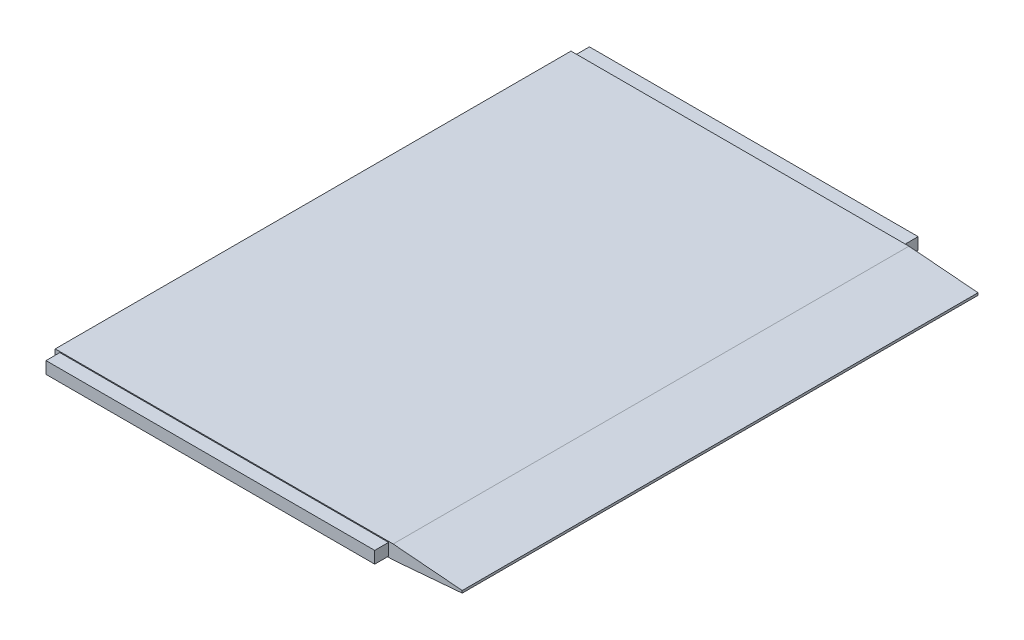
ISO-10303-21;
HEADER;
FILE_DESCRIPTION(('STEP AP214'),'2;1');
FILE_NAME('part.step','',(''),(''),'','','');
FILE_SCHEMA(('AUTOMOTIVE_DESIGN { 1 0 10303 214 1 1 1 1 }'));
ENDSEC;
DATA;
#1=APPLICATION_CONTEXT('core data for automotive mechanical design processes');
#2=APPLICATION_PROTOCOL_DEFINITION('international standard','automotive_design',2000,#1);
#3=PRODUCT_CONTEXT('',#1,'mechanical');
#4=PRODUCT('Part','Part','',(#3));
#5=PRODUCT_RELATED_PRODUCT_CATEGORY('part','',(#4));
#6=PRODUCT_DEFINITION_FORMATION('','',#4);
#7=PRODUCT_DEFINITION_CONTEXT('part definition',#1,'design');
#8=PRODUCT_DEFINITION('design','',#6,#7);
#9=PRODUCT_DEFINITION_SHAPE('','',#8);
#10=(LENGTH_UNIT() NAMED_UNIT(*) SI_UNIT(.MILLI.,.METRE.));
#11=(NAMED_UNIT(*) PLANE_ANGLE_UNIT() SI_UNIT($,.RADIAN.));
#12=(NAMED_UNIT(*) SI_UNIT($,.STERADIAN.) SOLID_ANGLE_UNIT());
#13=UNCERTAINTY_MEASURE_WITH_UNIT(LENGTH_MEASURE(1.E-05),#10,'distance_accuracy_value','');
#14=(GEOMETRIC_REPRESENTATION_CONTEXT(3) GLOBAL_UNCERTAINTY_ASSIGNED_CONTEXT((#13)) GLOBAL_UNIT_ASSIGNED_CONTEXT((#10,
#11,#12)) REPRESENTATION_CONTEXT('',''));
#15=CARTESIAN_POINT('',(0.,0.,0.));
#16=DIRECTION('',(0.,0.,1.));
#17=DIRECTION('',(1.,0.,0.));
#18=AXIS2_PLACEMENT_3D('',#15,#16,#17);
#19=CARTESIAN_POINT('',(26.5243661329157,-94.9181414529809,115.));
#20=DIRECTION('',(1.,0.,0.));
#21=DIRECTION('',(0.,0.,-1.));
#22=AXIS2_PLACEMENT_3D('',#19,#20,#21);
#23=PLANE('',#22);
#24=DIRECTION('',(0.,-1.,0.));
#25=VECTOR('',#24,1.);
#26=CARTESIAN_POINT('',(26.5243661329157,-94.9181414529809,3.));
#27=LINE('',#26,#25);
#28=CARTESIAN_POINT('',(26.5243661329157,-94.9181414529809,3.));
#29=VERTEX_POINT('',#28);
#30=CARTESIAN_POINT('',(26.5243661329157,-97.9181414529809,3.));
#31=VERTEX_POINT('',#30);
#32=EDGE_CURVE('E197',#29,#31,#27,.T.);
#33=ORIENTED_EDGE('',*,*,#32,.T.);
#34=DIRECTION('',(0.,0.,-1.));
#35=VECTOR('',#34,1.);
#36=CARTESIAN_POINT('',(26.5243661329157,-97.9181414529809,115.));
#37=LINE('',#36,#35);
#38=CARTESIAN_POINT('',(26.5243661329157,-97.9181414529809,115.));
#39=VERTEX_POINT('',#38);
#40=EDGE_CURVE('E11',#39,#31,#37,.T.);
#41=ORIENTED_EDGE('',*,*,#40,.F.);
#42=DIRECTION('',(0.,-1.,0.));
#43=VECTOR('',#42,1.);
#44=CARTESIAN_POINT('',(26.5243661329157,-94.9181414529809,115.));
#45=LINE('',#44,#43);
#46=CARTESIAN_POINT('',(26.5243661329157,-94.9181414529809,115.));
#47=VERTEX_POINT('',#46);
#48=EDGE_CURVE('E198',#47,#39,#45,.T.);
#49=ORIENTED_EDGE('',*,*,#48,.F.);
#50=DIRECTION('',(0.,0.,-1.));
#51=VECTOR('',#50,1.);
#52=CARTESIAN_POINT('',(26.5243661329157,-94.9181414529809,115.));
#53=LINE('',#52,#51);
#54=EDGE_CURVE('E212',#47,#29,#53,.T.);
#55=ORIENTED_EDGE('',*,*,#54,.T.);
#56=EDGE_LOOP('',(#33,#41,#49,#55));
#57=FACE_BOUND('',#56,.T.);
#58=ADVANCED_FACE('F39',(#57),#23,.F.);
#59=CARTESIAN_POINT('',(26.5243661329157,-97.9181414529809,115.));
#60=DIRECTION('',(0.,1.,0.));
#61=DIRECTION('',(0.,0.,1.));
#62=AXIS2_PLACEMENT_3D('',#59,#60,#61);
#63=PLANE('',#62);
#64=DIRECTION('',(1.,0.,0.));
#65=VECTOR('',#64,1.);
#66=CARTESIAN_POINT('',(26.5243661329157,-97.9181414529809,3.));
#67=LINE('',#66,#65);
#68=CARTESIAN_POINT('',(99.9066664678467,-97.9181414529809,3.));
#69=VERTEX_POINT('',#68);
#70=EDGE_CURVE('E215',#31,#69,#67,.T.);
#71=ORIENTED_EDGE('',*,*,#70,.T.);
#72=DIRECTION('',(0.,0.,-1.));
#73=VECTOR('',#72,1.);
#74=CARTESIAN_POINT('',(99.9066664678467,-97.9181414529809,115.));
#75=LINE('',#74,#73);
#76=CARTESIAN_POINT('',(99.9066664678467,-97.9181414529809,115.));
#77=VERTEX_POINT('',#76);
#78=EDGE_CURVE('E46',#77,#69,#75,.T.);
#79=ORIENTED_EDGE('',*,*,#78,.F.);
#80=DIRECTION('',(1.,0.,0.));
#81=VECTOR('',#80,1.);
#82=CARTESIAN_POINT('',(26.5243661329157,-97.9181414529809,115.));
#83=LINE('',#82,#81);
#84=EDGE_CURVE('E201',#39,#77,#83,.T.);
#85=ORIENTED_EDGE('',*,*,#84,.F.);
#86=ORIENTED_EDGE('',*,*,#40,.T.);
#87=EDGE_LOOP('',(#71,#79,#85,#86));
#88=FACE_BOUND('',#87,.T.);
#89=ADVANCED_FACE('F262',(#88),#63,.F.);
#90=CARTESIAN_POINT('',(99.9066664678467,-97.9181414529809,115.));
#91=DIRECTION('',(-0.08304547985374,0.99654575824488,0.));
#92=DIRECTION('',(-0.99654575824488,-0.0830454798537401,0.));
#93=AXIS2_PLACEMENT_3D('',#90,#91,#92);
#94=PLANE('',#93);
#95=DIRECTION('',(0.99654575824488,0.08304547985374,0.));
#96=VECTOR('',#95,1.);
#97=CARTESIAN_POINT('',(99.9066664678467,-97.9181414529809,3.));
#98=LINE('',#97,#96);
#99=CARTESIAN_POINT('',(114.906666467847,-96.6681414529809,3.));
#100=VERTEX_POINT('',#99);
#101=EDGE_CURVE('E217',#69,#100,#98,.T.);
#102=ORIENTED_EDGE('',*,*,#101,.T.);
#103=DIRECTION('',(0.,0.,-1.));
#104=VECTOR('',#103,1.);
#105=CARTESIAN_POINT('',(114.906666467847,-96.6681414529809,115.));
#106=LINE('',#105,#104);
#107=CARTESIAN_POINT('',(114.906666467847,-96.6681414529809,115.));
#108=VERTEX_POINT('',#107);
#109=EDGE_CURVE('E232',#108,#100,#106,.T.);
#110=ORIENTED_EDGE('',*,*,#109,.F.);
#111=DIRECTION('',(0.99654575824488,0.08304547985374,0.));
#112=VECTOR('',#111,1.);
#113=CARTESIAN_POINT('',(99.9066664678467,-97.9181414529809,115.));
#114=LINE('',#113,#112);
#115=EDGE_CURVE('E204',#77,#108,#114,.T.);
#116=ORIENTED_EDGE('',*,*,#115,.F.);
#117=ORIENTED_EDGE('',*,*,#78,.T.);
#118=EDGE_LOOP('',(#102,#110,#116,#117));
#119=FACE_BOUND('',#118,.T.);
#120=ADVANCED_FACE('F239',(#119),#94,.F.);
#121=CARTESIAN_POINT('',(114.906666467847,-96.6681414529809,115.));
#122=DIRECTION('',(-1.,0.,0.));
#123=DIRECTION('',(0.,0.,1.));
#124=AXIS2_PLACEMENT_3D('',#121,#122,#123);
#125=PLANE('',#124);
#126=DIRECTION('',(0.,1.,0.));
#127=VECTOR('',#126,1.);
#128=CARTESIAN_POINT('',(114.906666467847,-96.6681414529809,3.));
#129=LINE('',#128,#127);
#130=CARTESIAN_POINT('',(114.906666467847,-96.1681414529809,3.));
#131=VERTEX_POINT('',#130);
#132=EDGE_CURVE('E219',#100,#131,#129,.T.);
#133=ORIENTED_EDGE('',*,*,#132,.T.);
#134=DIRECTION('',(0.,0.,-1.));
#135=VECTOR('',#134,1.);
#136=CARTESIAN_POINT('',(114.906666467847,-96.1681414529809,115.));
#137=LINE('',#136,#135);
#138=CARTESIAN_POINT('',(114.906666467847,-96.1681414529809,115.));
#139=VERTEX_POINT('',#138);
#140=EDGE_CURVE('E229',#139,#131,#137,.T.);
#141=ORIENTED_EDGE('',*,*,#140,.F.);
#142=DIRECTION('',(0.,1.,0.));
#143=VECTOR('',#142,1.);
#144=CARTESIAN_POINT('',(114.906666467847,-96.6681414529809,115.));
#145=LINE('',#144,#143);
#146=EDGE_CURVE('E206',#108,#139,#145,.T.);
#147=ORIENTED_EDGE('',*,*,#146,.F.);
#148=ORIENTED_EDGE('',*,*,#109,.T.);
#149=EDGE_LOOP('',(#133,#141,#147,#148));
#150=FACE_BOUND('',#149,.T.);
#151=ADVANCED_FACE('F250',(#150),#125,.F.);
#152=CARTESIAN_POINT('',(114.906666467847,-96.1681414529809,115.));
#153=DIRECTION('',(-0.08304547985374,-0.99654575824488,0.));
#154=DIRECTION('',(0.99654575824488,-0.0830454798537401,0.));
#155=AXIS2_PLACEMENT_3D('',#152,#153,#154);
#156=PLANE('',#155);
#157=DIRECTION('',(-0.99654575824488,0.08304547985374,0.));
#158=VECTOR('',#157,1.);
#159=CARTESIAN_POINT('',(114.906666467847,-96.1681414529809,3.));
#160=LINE('',#159,#158);
#161=CARTESIAN_POINT('',(99.9066664678467,-94.9181414529809,3.));
#162=VERTEX_POINT('',#161);
#163=EDGE_CURVE('E221',#131,#162,#160,.T.);
#164=ORIENTED_EDGE('',*,*,#163,.T.);
#165=DIRECTION('',(0.,0.,-1.));
#166=VECTOR('',#165,1.);
#167=CARTESIAN_POINT('',(99.9066664678467,-94.9181414529809,115.));
#168=LINE('',#167,#166);
#169=CARTESIAN_POINT('',(99.9066664678467,-94.9181414529809,115.));
#170=VERTEX_POINT('',#169);
#171=EDGE_CURVE('E226',#170,#162,#168,.T.);
#172=ORIENTED_EDGE('',*,*,#171,.F.);
#173=DIRECTION('',(-0.99654575824488,0.08304547985374,0.));
#174=VECTOR('',#173,1.);
#175=CARTESIAN_POINT('',(114.906666467847,-96.1681414529809,115.));
#176=LINE('',#175,#174);
#177=EDGE_CURVE('E208',#139,#170,#176,.T.);
#178=ORIENTED_EDGE('',*,*,#177,.F.);
#179=ORIENTED_EDGE('',*,*,#140,.T.);
#180=EDGE_LOOP('',(#164,#172,#178,#179));
#181=FACE_BOUND('',#180,.T.);
#182=ADVANCED_FACE('F254',(#181),#156,.F.);
#183=CARTESIAN_POINT('',(99.9066664678467,-94.9181414529809,115.));
#184=DIRECTION('',(0.,-1.,0.));
#185=DIRECTION('',(0.,0.,-1.));
#186=AXIS2_PLACEMENT_3D('',#183,#184,#185);
#187=PLANE('',#186);
#188=DIRECTION('',(-1.,0.,0.));
#189=VECTOR('',#188,1.);
#190=CARTESIAN_POINT('',(99.9066664678467,-94.9181414529809,3.));
#191=LINE('',#190,#189);
#192=EDGE_CURVE('E202',#162,#29,#191,.T.);
#193=ORIENTED_EDGE('',*,*,#192,.T.);
#194=ORIENTED_EDGE('',*,*,#54,.F.);
#195=DIRECTION('',(-1.,0.,0.));
#196=VECTOR('',#195,1.);
#197=CARTESIAN_POINT('',(99.9066664678467,-94.9181414529809,115.));
#198=LINE('',#197,#196);
#199=EDGE_CURVE('E210',#170,#47,#198,.T.);
#200=ORIENTED_EDGE('',*,*,#199,.F.);
#201=ORIENTED_EDGE('',*,*,#171,.T.);
#202=EDGE_LOOP('',(#193,#194,#200,#201));
#203=FACE_BOUND('',#202,.T.);
#204=ADVANCED_FACE('F265',(#203),#187,.F.);
#205=CARTESIAN_POINT('',(0.,0.,115.));
#206=DIRECTION('',(0.,0.,1.));
#207=DIRECTION('',(1.,0.,0.));
#208=AXIS2_PLACEMENT_3D('',#205,#206,#207);
#209=PLANE('',#208);
#210=DIRECTION('',(0.,-1.,0.));
#211=VECTOR('',#210,1.);
#212=CARTESIAN_POINT('',(27.5243661329157,-95.1181414529809,115.));
#213=LINE('',#212,#211);
#214=CARTESIAN_POINT('',(27.5243661329157,-95.1181414529809,115.));
#215=VERTEX_POINT('',#214);
#216=CARTESIAN_POINT('',(27.5243661329157,-97.7181414529809,115.));
#217=VERTEX_POINT('',#216);
#218=EDGE_CURVE('E53',#215,#217,#213,.T.);
#219=ORIENTED_EDGE('',*,*,#218,.F.);
#220=DIRECTION('',(-1.,0.,0.));
#221=VECTOR('',#220,1.);
#222=CARTESIAN_POINT('',(98.9066664678467,-95.1181414529809,115.));
#223=LINE('',#222,#221);
#224=CARTESIAN_POINT('',(98.9066664678467,-95.1181414529809,115.));
#225=VERTEX_POINT('',#224);
#226=EDGE_CURVE('E57',#225,#215,#223,.T.);
#227=ORIENTED_EDGE('',*,*,#226,.F.);
#228=DIRECTION('',(0.,1.,0.));
#229=VECTOR('',#228,1.);
#230=CARTESIAN_POINT('',(98.9066664678467,-97.7181414529809,115.));
#231=LINE('',#230,#229);
#232=CARTESIAN_POINT('',(98.9066664678467,-97.7181414529809,115.));
#233=VERTEX_POINT('',#232);
#234=EDGE_CURVE('E413',#233,#225,#231,.T.);
#235=ORIENTED_EDGE('',*,*,#234,.F.);
#236=DIRECTION('',(1.,0.,0.));
#237=VECTOR('',#236,1.);
#238=CARTESIAN_POINT('',(27.5243661329157,-97.7181414529809,115.));
#239=LINE('',#238,#237);
#240=EDGE_CURVE('E419',#217,#233,#239,.T.);
#241=ORIENTED_EDGE('',*,*,#240,.F.);
#242=EDGE_LOOP('',(#219,#227,#235,#241));
#243=FACE_BOUND('',#242,.T.);
#244=ORIENTED_EDGE('',*,*,#48,.T.);
#245=ORIENTED_EDGE('',*,*,#84,.T.);
#246=ORIENTED_EDGE('',*,*,#115,.T.);
#247=ORIENTED_EDGE('',*,*,#146,.T.);
#248=ORIENTED_EDGE('',*,*,#177,.T.);
#249=ORIENTED_EDGE('',*,*,#199,.T.);
#250=EDGE_LOOP('',(#244,#245,#246,#247,#248,#249));
#251=FACE_BOUND('',#250,.T.);
#252=ADVANCED_FACE('F258',(#243,#251),#209,.T.);
#253=CARTESIAN_POINT('',(0.,0.,3.));
#254=DIRECTION('',(0.,0.,1.));
#255=DIRECTION('',(1.,0.,0.));
#256=AXIS2_PLACEMENT_3D('',#253,#254,#255);
#257=PLANE('',#256);
#258=DIRECTION('',(-1.,0.,0.));
#259=VECTOR('',#258,1.);
#260=CARTESIAN_POINT('',(98.9066664678467,-95.1181414529809,3.));
#261=LINE('',#260,#259);
#262=CARTESIAN_POINT('',(98.9066664678467,-95.1181414529809,3.));
#263=VERTEX_POINT('',#262);
#264=CARTESIAN_POINT('',(27.5243661329157,-95.1181414529809,3.));
#265=VERTEX_POINT('',#264);
#266=EDGE_CURVE('E178',#263,#265,#261,.T.);
#267=ORIENTED_EDGE('',*,*,#266,.T.);
#268=DIRECTION('',(0.,-1.,0.));
#269=VECTOR('',#268,1.);
#270=CARTESIAN_POINT('',(27.5243661329157,-95.1181414529809,3.));
#271=LINE('',#270,#269);
#272=CARTESIAN_POINT('',(27.5243661329157,-97.7181414529809,3.));
#273=VERTEX_POINT('',#272);
#274=EDGE_CURVE('E168',#265,#273,#271,.T.);
#275=ORIENTED_EDGE('',*,*,#274,.T.);
#276=DIRECTION('',(1.,0.,0.));
#277=VECTOR('',#276,1.);
#278=CARTESIAN_POINT('',(27.5243661329157,-97.7181414529809,3.));
#279=LINE('',#278,#277);
#280=CARTESIAN_POINT('',(98.9066664678467,-97.7181414529809,3.));
#281=VERTEX_POINT('',#280);
#282=EDGE_CURVE('E171',#273,#281,#279,.T.);
#283=ORIENTED_EDGE('',*,*,#282,.T.);
#284=DIRECTION('',(0.,1.,0.));
#285=VECTOR('',#284,1.);
#286=CARTESIAN_POINT('',(98.9066664678467,-97.7181414529809,3.));
#287=LINE('',#286,#285);
#288=EDGE_CURVE('E175',#281,#263,#287,.T.);
#289=ORIENTED_EDGE('',*,*,#288,.T.);
#290=EDGE_LOOP('',(#267,#275,#283,#289));
#291=FACE_BOUND('',#290,.T.);
#292=ORIENTED_EDGE('',*,*,#32,.F.);
#293=ORIENTED_EDGE('',*,*,#192,.F.);
#294=ORIENTED_EDGE('',*,*,#163,.F.);
#295=ORIENTED_EDGE('',*,*,#132,.F.);
#296=ORIENTED_EDGE('',*,*,#101,.F.);
#297=ORIENTED_EDGE('',*,*,#70,.F.);
#298=EDGE_LOOP('',(#292,#293,#294,#295,#296,#297));
#299=FACE_BOUND('',#298,.T.);
#300=ADVANCED_FACE('F245',(#291,#299),#257,.F.);
#301=CARTESIAN_POINT('',(27.5243661329157,-95.1181414529809,3.));
#302=DIRECTION('',(1.,0.,0.));
#303=DIRECTION('',(0.,0.,-1.));
#304=AXIS2_PLACEMENT_3D('',#301,#302,#303);
#305=PLANE('',#304);
#306=DIRECTION('',(0.,-1.,0.));
#307=VECTOR('',#306,1.);
#308=CARTESIAN_POINT('',(27.5243661329157,-95.1181414529809,0.));
#309=LINE('',#308,#307);
#310=CARTESIAN_POINT('',(27.5243661329157,-95.1181414529809,0.));
#311=VERTEX_POINT('',#310);
#312=CARTESIAN_POINT('',(27.5243661329157,-97.7181414529809,0.));
#313=VERTEX_POINT('',#312);
#314=EDGE_CURVE('E159',#311,#313,#309,.T.);
#315=ORIENTED_EDGE('',*,*,#314,.T.);
#316=DIRECTION('',(0.,0.,-1.));
#317=VECTOR('',#316,1.);
#318=CARTESIAN_POINT('',(27.5243661329157,-97.7181414529809,3.));
#319=LINE('',#318,#317);
#320=EDGE_CURVE('E194',#273,#313,#319,.T.);
#321=ORIENTED_EDGE('',*,*,#320,.F.);
#322=ORIENTED_EDGE('',*,*,#274,.F.);
#323=DIRECTION('',(0.,0.,-1.));
#324=VECTOR('',#323,1.);
#325=CARTESIAN_POINT('',(27.5243661329157,-95.1181414529809,3.));
#326=LINE('',#325,#324);
#327=EDGE_CURVE('E180',#265,#311,#326,.T.);
#328=ORIENTED_EDGE('',*,*,#327,.T.);
#329=EDGE_LOOP('',(#315,#321,#322,#328));
#330=FACE_BOUND('',#329,.T.);
#331=ADVANCED_FACE('F316',(#330),#305,.F.);
#332=CARTESIAN_POINT('',(27.5243661329157,-97.7181414529809,3.));
#333=DIRECTION('',(0.,1.,0.));
#334=DIRECTION('',(0.,0.,1.));
#335=AXIS2_PLACEMENT_3D('',#332,#333,#334);
#336=PLANE('',#335);
#337=DIRECTION('',(1.,0.,0.));
#338=VECTOR('',#337,1.);
#339=CARTESIAN_POINT('',(27.5243661329157,-97.7181414529809,0.));
#340=LINE('',#339,#338);
#341=CARTESIAN_POINT('',(98.9066664678467,-97.7181414529809,0.));
#342=VERTEX_POINT('',#341);
#343=EDGE_CURVE('E162',#313,#342,#340,.T.);
#344=ORIENTED_EDGE('',*,*,#343,.T.);
#345=DIRECTION('',(0.,0.,-1.));
#346=VECTOR('',#345,1.);
#347=CARTESIAN_POINT('',(98.9066664678467,-97.7181414529809,3.));
#348=LINE('',#347,#346);
#349=EDGE_CURVE('E191',#281,#342,#348,.T.);
#350=ORIENTED_EDGE('',*,*,#349,.F.);
#351=ORIENTED_EDGE('',*,*,#282,.F.);
#352=ORIENTED_EDGE('',*,*,#320,.T.);
#353=EDGE_LOOP('',(#344,#350,#351,#352));
#354=FACE_BOUND('',#353,.T.);
#355=ADVANCED_FACE('F325',(#354),#336,.F.);
#356=CARTESIAN_POINT('',(98.9066664678467,-97.7181414529809,3.));
#357=DIRECTION('',(-1.,0.,0.));
#358=DIRECTION('',(0.,0.,1.));
#359=AXIS2_PLACEMENT_3D('',#356,#357,#358);
#360=PLANE('',#359);
#361=DIRECTION('',(0.,1.,0.));
#362=VECTOR('',#361,1.);
#363=CARTESIAN_POINT('',(98.9066664678467,-97.7181414529809,0.));
#364=LINE('',#363,#362);
#365=CARTESIAN_POINT('',(98.9066664678467,-95.1181414529809,0.));
#366=VERTEX_POINT('',#365);
#367=EDGE_CURVE('E183',#342,#366,#364,.T.);
#368=ORIENTED_EDGE('',*,*,#367,.T.);
#369=DIRECTION('',(0.,0.,-1.));
#370=VECTOR('',#369,1.);
#371=CARTESIAN_POINT('',(98.9066664678467,-95.1181414529809,3.));
#372=LINE('',#371,#370);
#373=EDGE_CURVE('E188',#263,#366,#372,.T.);
#374=ORIENTED_EDGE('',*,*,#373,.F.);
#375=ORIENTED_EDGE('',*,*,#288,.F.);
#376=ORIENTED_EDGE('',*,*,#349,.T.);
#377=EDGE_LOOP('',(#368,#374,#375,#376));
#378=FACE_BOUND('',#377,.T.);
#379=ADVANCED_FACE('F335',(#378),#360,.F.);
#380=CARTESIAN_POINT('',(98.9066664678467,-95.1181414529809,3.));
#381=DIRECTION('',(0.,-1.,0.));
#382=DIRECTION('',(0.,0.,-1.));
#383=AXIS2_PLACEMENT_3D('',#380,#381,#382);
#384=PLANE('',#383);
#385=DIRECTION('',(-1.,0.,0.));
#386=VECTOR('',#385,1.);
#387=CARTESIAN_POINT('',(98.9066664678467,-95.1181414529809,0.));
#388=LINE('',#387,#386);
#389=EDGE_CURVE('E172',#366,#311,#388,.T.);
#390=ORIENTED_EDGE('',*,*,#389,.T.);
#391=ORIENTED_EDGE('',*,*,#327,.F.);
#392=ORIENTED_EDGE('',*,*,#266,.F.);
#393=ORIENTED_EDGE('',*,*,#373,.T.);
#394=EDGE_LOOP('',(#390,#391,#392,#393));
#395=FACE_BOUND('',#394,.T.);
#396=ADVANCED_FACE('F345',(#395),#384,.F.);
#397=CARTESIAN_POINT('',(0.,0.,0.));
#398=DIRECTION('',(0.,0.,1.));
#399=DIRECTION('',(1.,0.,0.));
#400=AXIS2_PLACEMENT_3D('',#397,#398,#399);
#401=PLANE('',#400);
#402=ORIENTED_EDGE('',*,*,#314,.F.);
#403=ORIENTED_EDGE('',*,*,#389,.F.);
#404=ORIENTED_EDGE('',*,*,#367,.F.);
#405=ORIENTED_EDGE('',*,*,#343,.F.);
#406=EDGE_LOOP('',(#402,#403,#404,#405));
#407=FACE_BOUND('',#406,.T.);
#408=ADVANCED_FACE('F355',(#407),#401,.F.);
#409=CARTESIAN_POINT('',(27.5243661329157,-95.1181414529809,118.));
#410=DIRECTION('',(1.,0.,0.));
#411=DIRECTION('',(0.,0.,-1.));
#412=AXIS2_PLACEMENT_3D('',#409,#410,#411);
#413=PLANE('',#412);
#414=ORIENTED_EDGE('',*,*,#218,.T.);
#415=DIRECTION('',(0.,0.,-1.));
#416=VECTOR('',#415,1.);
#417=CARTESIAN_POINT('',(27.5243661329157,-97.7181414529809,118.));
#418=LINE('',#417,#416);
#419=CARTESIAN_POINT('',(27.5243661329157,-97.7181414529809,118.));
#420=VERTEX_POINT('',#419);
#421=EDGE_CURVE('E142',#420,#217,#418,.T.);
#422=ORIENTED_EDGE('',*,*,#421,.F.);
#423=DIRECTION('',(0.,-1.,0.));
#424=VECTOR('',#423,1.);
#425=CARTESIAN_POINT('',(27.5243661329157,-95.1181414529809,118.));
#426=LINE('',#425,#424);
#427=CARTESIAN_POINT('',(27.5243661329157,-95.1181414529809,118.));
#428=VERTEX_POINT('',#427);
#429=EDGE_CURVE('E148',#428,#420,#426,.T.);
#430=ORIENTED_EDGE('',*,*,#429,.F.);
#431=DIRECTION('',(0.,0.,-1.));
#432=VECTOR('',#431,1.);
#433=CARTESIAN_POINT('',(27.5243661329157,-95.1181414529809,118.));
#434=LINE('',#433,#432);
#435=EDGE_CURVE('E411',#428,#215,#434,.T.);
#436=ORIENTED_EDGE('',*,*,#435,.T.);
#437=EDGE_LOOP('',(#414,#422,#430,#436));
#438=FACE_BOUND('',#437,.T.);
#439=ADVANCED_FACE('F158',(#438),#413,.F.);
#440=CARTESIAN_POINT('',(27.5243661329157,-97.7181414529809,118.));
#441=DIRECTION('',(0.,1.,0.));
#442=DIRECTION('',(0.,0.,1.));
#443=AXIS2_PLACEMENT_3D('',#440,#441,#442);
#444=PLANE('',#443);
#445=ORIENTED_EDGE('',*,*,#240,.T.);
#446=DIRECTION('',(0.,0.,-1.));
#447=VECTOR('',#446,1.);
#448=CARTESIAN_POINT('',(98.9066664678467,-97.7181414529809,118.));
#449=LINE('',#448,#447);
#450=CARTESIAN_POINT('',(98.9066664678467,-97.7181414529809,118.));
#451=VERTEX_POINT('',#450);
#452=EDGE_CURVE('E144',#451,#233,#449,.T.);
#453=ORIENTED_EDGE('',*,*,#452,.F.);
#454=DIRECTION('',(1.,0.,0.));
#455=VECTOR('',#454,1.);
#456=CARTESIAN_POINT('',(27.5243661329157,-97.7181414529809,118.));
#457=LINE('',#456,#455);
#458=EDGE_CURVE('E137',#420,#451,#457,.T.);
#459=ORIENTED_EDGE('',*,*,#458,.F.);
#460=ORIENTED_EDGE('',*,*,#421,.T.);
#461=EDGE_LOOP('',(#445,#453,#459,#460));
#462=FACE_BOUND('',#461,.T.);
#463=ADVANCED_FACE('F140',(#462),#444,.F.);
#464=CARTESIAN_POINT('',(98.9066664678467,-97.7181414529809,118.));
#465=DIRECTION('',(-1.,0.,0.));
#466=DIRECTION('',(0.,0.,1.));
#467=AXIS2_PLACEMENT_3D('',#464,#465,#466);
#468=PLANE('',#467);
#469=ORIENTED_EDGE('',*,*,#234,.T.);
#470=DIRECTION('',(0.,0.,-1.));
#471=VECTOR('',#470,1.);
#472=CARTESIAN_POINT('',(98.9066664678467,-95.1181414529809,118.));
#473=LINE('',#472,#471);
#474=CARTESIAN_POINT('',(98.9066664678467,-95.1181414529809,118.));
#475=VERTEX_POINT('',#474);
#476=EDGE_CURVE('E164',#475,#225,#473,.T.);
#477=ORIENTED_EDGE('',*,*,#476,.F.);
#478=DIRECTION('',(0.,1.,0.));
#479=VECTOR('',#478,1.);
#480=CARTESIAN_POINT('',(98.9066664678467,-97.7181414529809,118.));
#481=LINE('',#480,#479);
#482=EDGE_CURVE('E147',#451,#475,#481,.T.);
#483=ORIENTED_EDGE('',*,*,#482,.F.);
#484=ORIENTED_EDGE('',*,*,#452,.T.);
#485=EDGE_LOOP('',(#469,#477,#483,#484));
#486=FACE_BOUND('',#485,.T.);
#487=ADVANCED_FACE('F380',(#486),#468,.F.);
#488=CARTESIAN_POINT('',(98.9066664678467,-95.1181414529809,118.));
#489=DIRECTION('',(0.,-1.,0.));
#490=DIRECTION('',(0.,0.,-1.));
#491=AXIS2_PLACEMENT_3D('',#488,#489,#490);
#492=PLANE('',#491);
#493=ORIENTED_EDGE('',*,*,#226,.T.);
#494=ORIENTED_EDGE('',*,*,#435,.F.);
#495=DIRECTION('',(-1.,0.,0.));
#496=VECTOR('',#495,1.);
#497=CARTESIAN_POINT('',(98.9066664678467,-95.1181414529809,118.));
#498=LINE('',#497,#496);
#499=EDGE_CURVE('E153',#475,#428,#498,.T.);
#500=ORIENTED_EDGE('',*,*,#499,.F.);
#501=ORIENTED_EDGE('',*,*,#476,.T.);
#502=EDGE_LOOP('',(#493,#494,#500,#501));
#503=FACE_BOUND('',#502,.T.);
#504=ADVANCED_FACE('F389',(#503),#492,.F.);
#505=CARTESIAN_POINT('',(0.,0.,118.));
#506=DIRECTION('',(0.,0.,1.));
#507=DIRECTION('',(1.,0.,0.));
#508=AXIS2_PLACEMENT_3D('',#505,#506,#507);
#509=PLANE('',#508);
#510=ORIENTED_EDGE('',*,*,#429,.T.);
#511=ORIENTED_EDGE('',*,*,#458,.T.);
#512=ORIENTED_EDGE('',*,*,#482,.T.);
#513=ORIENTED_EDGE('',*,*,#499,.T.);
#514=EDGE_LOOP('',(#510,#511,#512,#513));
#515=FACE_BOUND('',#514,.T.);
#516=ADVANCED_FACE('F151',(#515),#509,.T.);
#517=CLOSED_SHELL('',(#58,#89,#120,#151,#182,#204,#252,#300,#331,#355,#379,#396,#408,#439,#463,
#487,#504,#516));
#518=MANIFOLD_SOLID_BREP('B2',#517);
#519=ADVANCED_BREP_SHAPE_REPRESENTATION('',(#18,#518),#14);
#520=SHAPE_DEFINITION_REPRESENTATION(#9,#519);
ENDSEC;
END-ISO-10303-21;
